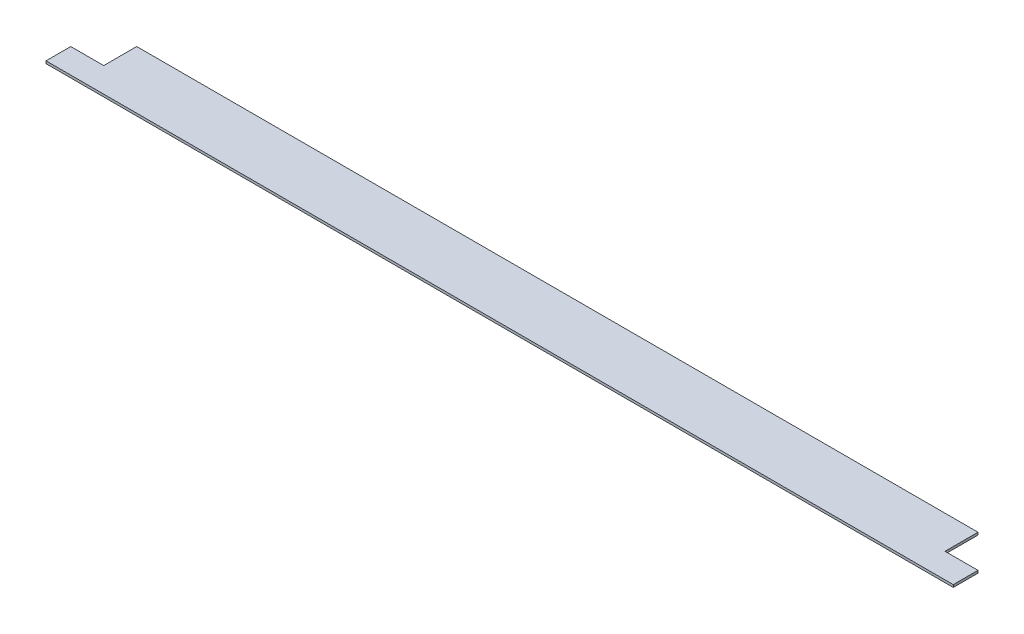
ISO-10303-21;
HEADER;
FILE_DESCRIPTION(('STEP AP214'),'2;1');
FILE_NAME('part.step','',(''),(''),'','','');
FILE_SCHEMA(('AUTOMOTIVE_DESIGN { 1 0 10303 214 1 1 1 1 }'));
ENDSEC;
DATA;
#1=APPLICATION_CONTEXT('core data for automotive mechanical design processes');
#2=APPLICATION_PROTOCOL_DEFINITION('international standard','automotive_design',2000,#1);
#3=PRODUCT_CONTEXT('',#1,'mechanical');
#4=PRODUCT('Part','Part','',(#3));
#5=PRODUCT_RELATED_PRODUCT_CATEGORY('part','',(#4));
#6=PRODUCT_DEFINITION_FORMATION('','',#4);
#7=PRODUCT_DEFINITION_CONTEXT('part definition',#1,'design');
#8=PRODUCT_DEFINITION('design','',#6,#7);
#9=PRODUCT_DEFINITION_SHAPE('','',#8);
#10=(LENGTH_UNIT() NAMED_UNIT(*) SI_UNIT(.MILLI.,.METRE.));
#11=(NAMED_UNIT(*) PLANE_ANGLE_UNIT() SI_UNIT($,.RADIAN.));
#12=(NAMED_UNIT(*) SI_UNIT($,.STERADIAN.) SOLID_ANGLE_UNIT());
#13=UNCERTAINTY_MEASURE_WITH_UNIT(LENGTH_MEASURE(1.E-05),#10,'distance_accuracy_value','');
#14=(GEOMETRIC_REPRESENTATION_CONTEXT(3) GLOBAL_UNCERTAINTY_ASSIGNED_CONTEXT((#13)) GLOBAL_UNIT_ASSIGNED_CONTEXT((#10,
#11,#12)) REPRESENTATION_CONTEXT('',''));
#15=CARTESIAN_POINT('',(0.,0.,0.));
#16=DIRECTION('',(0.,0.,1.));
#17=DIRECTION('',(1.,0.,0.));
#18=AXIS2_PLACEMENT_3D('',#15,#16,#17);
#19=CARTESIAN_POINT('',(-550.,3.,35.0000000000001));
#20=DIRECTION('',(1.,0.,0.));
#21=DIRECTION('',(0.,0.,-1.));
#22=AXIS2_PLACEMENT_3D('',#19,#20,#21);
#23=PLANE('',#22);
#24=DIRECTION('',(0.,0.,1.));
#25=VECTOR('',#24,1.);
#26=CARTESIAN_POINT('',(-550.,3.,35.0000000000001));
#27=LINE('',#26,#25);
#28=CARTESIAN_POINT('',(-550.,3.,5.00000000000005));
#29=VERTEX_POINT('',#28);
#30=CARTESIAN_POINT('',(-550.,3.,35.0000000000001));
#31=VERTEX_POINT('',#30);
#32=EDGE_CURVE('E135',#29,#31,#27,.T.);
#33=ORIENTED_EDGE('',*,*,#32,.F.);
#34=DIRECTION('',(0.,1.,0.));
#35=VECTOR('',#34,1.);
#36=CARTESIAN_POINT('',(-550.,-7.,5.00000000000005));
#37=LINE('',#36,#35);
#38=CARTESIAN_POINT('',(-550.,0.,5.00000000000005));
#39=VERTEX_POINT('',#38);
#40=EDGE_CURVE('E151',#39,#29,#37,.T.);
#41=ORIENTED_EDGE('',*,*,#40,.F.);
#42=DIRECTION('',(0.,0.,1.));
#43=VECTOR('',#42,1.);
#44=CARTESIAN_POINT('',(-550.,0.,35.0000000000001));
#45=LINE('',#44,#43);
#46=CARTESIAN_POINT('',(-550.,0.,35.0000000000001));
#47=VERTEX_POINT('',#46);
#48=EDGE_CURVE('E127',#39,#47,#45,.T.);
#49=ORIENTED_EDGE('',*,*,#48,.T.);
#50=DIRECTION('',(0.,-1.,0.));
#51=VECTOR('',#50,1.);
#52=CARTESIAN_POINT('',(-550.,3.,35.0000000000001));
#53=LINE('',#52,#51);
#54=EDGE_CURVE('E121',#31,#47,#53,.T.);
#55=ORIENTED_EDGE('',*,*,#54,.F.);
#56=EDGE_LOOP('',(#33,#41,#49,#55));
#57=FACE_BOUND('',#56,.T.);
#58=ADVANCED_FACE('F33',(#57),#23,.F.);
#59=CARTESIAN_POINT('',(550.,3.,34.9999999999999));
#60=DIRECTION('',(0.,0.,-1.));
#61=DIRECTION('',(-1.,0.,0.));
#62=AXIS2_PLACEMENT_3D('',#59,#60,#61);
#63=PLANE('',#62);
#64=DIRECTION('',(1.,0.,0.));
#65=VECTOR('',#64,1.);
#66=CARTESIAN_POINT('',(550.,0.,34.9999999999999));
#67=LINE('',#66,#65);
#68=CARTESIAN_POINT('',(550.,0.,34.9999999999999));
#69=VERTEX_POINT('',#68);
#70=EDGE_CURVE('E129',#47,#69,#67,.T.);
#71=ORIENTED_EDGE('',*,*,#70,.T.);
#72=DIRECTION('',(0.,-1.,0.));
#73=VECTOR('',#72,1.);
#74=CARTESIAN_POINT('',(550.,3.,34.9999999999999));
#75=LINE('',#74,#73);
#76=CARTESIAN_POINT('',(550.,3.,34.9999999999999));
#77=VERTEX_POINT('',#76);
#78=EDGE_CURVE('E117',#77,#69,#75,.T.);
#79=ORIENTED_EDGE('',*,*,#78,.F.);
#80=DIRECTION('',(1.,0.,0.));
#81=VECTOR('',#80,1.);
#82=CARTESIAN_POINT('',(550.,3.,34.9999999999999));
#83=LINE('',#82,#81);
#84=EDGE_CURVE('E123',#31,#77,#83,.T.);
#85=ORIENTED_EDGE('',*,*,#84,.F.);
#86=ORIENTED_EDGE('',*,*,#54,.T.);
#87=EDGE_LOOP('',(#71,#79,#85,#86));
#88=FACE_BOUND('',#87,.T.);
#89=ADVANCED_FACE('F164',(#88),#63,.F.);
#90=CARTESIAN_POINT('',(550.,3.,34.9999999999999));
#91=DIRECTION('',(-1.,0.,0.));
#92=DIRECTION('',(0.,0.,1.));
#93=AXIS2_PLACEMENT_3D('',#90,#91,#92);
#94=PLANE('',#93);
#95=DIRECTION('',(0.,0.,-1.));
#96=VECTOR('',#95,1.);
#97=CARTESIAN_POINT('',(550.,0.,34.9999999999999));
#98=LINE('',#97,#96);
#99=CARTESIAN_POINT('',(550.,0.,4.99999999999991));
#100=VERTEX_POINT('',#99);
#101=EDGE_CURVE('E131',#69,#100,#98,.T.);
#102=ORIENTED_EDGE('',*,*,#101,.T.);
#103=DIRECTION('',(0.,1.,0.));
#104=VECTOR('',#103,1.);
#105=CARTESIAN_POINT('',(550.,-7.,4.99999999999991));
#106=LINE('',#105,#104);
#107=CARTESIAN_POINT('',(550.,3.,4.99999999999991));
#108=VERTEX_POINT('',#107);
#109=EDGE_CURVE('E169',#100,#108,#106,.T.);
#110=ORIENTED_EDGE('',*,*,#109,.T.);
#111=DIRECTION('',(0.,0.,-1.));
#112=VECTOR('',#111,1.);
#113=CARTESIAN_POINT('',(550.,3.,34.9999999999999));
#114=LINE('',#113,#112);
#115=EDGE_CURVE('E118',#77,#108,#114,.T.);
#116=ORIENTED_EDGE('',*,*,#115,.F.);
#117=ORIENTED_EDGE('',*,*,#78,.T.);
#118=EDGE_LOOP('',(#102,#110,#116,#117));
#119=FACE_BOUND('',#118,.T.);
#120=ADVANCED_FACE('F168',(#119),#94,.F.);
#121=CARTESIAN_POINT('',(550.,3.,-35.0000000000001));
#122=DIRECTION('',(0.,0.,1.));
#123=DIRECTION('',(1.,0.,0.));
#124=AXIS2_PLACEMENT_3D('',#121,#122,#123);
#125=PLANE('',#124);
#126=DIRECTION('',(-1.,0.,0.));
#127=VECTOR('',#126,1.);
#128=CARTESIAN_POINT('',(550.,3.,-35.0000000000001));
#129=LINE('',#128,#127);
#130=CARTESIAN_POINT('',(510.,3.,-35.0000000000001));
#131=VERTEX_POINT('',#130);
#132=CARTESIAN_POINT('',(-510.,3.,-35.));
#133=VERTEX_POINT('',#132);
#134=EDGE_CURVE('E109',#131,#133,#129,.T.);
#135=ORIENTED_EDGE('',*,*,#134,.F.);
#136=DIRECTION('',(0.,1.,0.));
#137=VECTOR('',#136,1.);
#138=CARTESIAN_POINT('',(510.,-7.,-35.0000000000001));
#139=LINE('',#138,#137);
#140=CARTESIAN_POINT('',(510.,0.,-35.0000000000001));
#141=VERTEX_POINT('',#140);
#142=EDGE_CURVE('E95',#141,#131,#139,.T.);
#143=ORIENTED_EDGE('',*,*,#142,.F.);
#144=DIRECTION('',(-1.,0.,0.));
#145=VECTOR('',#144,1.);
#146=CARTESIAN_POINT('',(550.,0.,-35.0000000000001));
#147=LINE('',#146,#145);
#148=CARTESIAN_POINT('',(-510.,0.,-35.));
#149=VERTEX_POINT('',#148);
#150=EDGE_CURVE('E134',#141,#149,#147,.T.);
#151=ORIENTED_EDGE('',*,*,#150,.T.);
#152=DIRECTION('',(0.,1.,0.));
#153=VECTOR('',#152,1.);
#154=CARTESIAN_POINT('',(-510.,-7.,-35.));
#155=LINE('',#154,#153);
#156=EDGE_CURVE('E116',#149,#133,#155,.T.);
#157=ORIENTED_EDGE('',*,*,#156,.T.);
#158=EDGE_LOOP('',(#135,#143,#151,#157));
#159=FACE_BOUND('',#158,.T.);
#160=ADVANCED_FACE('F114',(#159),#125,.F.);
#161=CARTESIAN_POINT('',(-550.,3.,-35.));
#162=DIRECTION('',(0.,1.,0.));
#163=DIRECTION('',(0.,0.,1.));
#164=AXIS2_PLACEMENT_3D('',#161,#162,#163);
#165=PLANE('',#164);
#166=DIRECTION('',(1.,0.,0.));
#167=VECTOR('',#166,1.);
#168=CARTESIAN_POINT('',(550.,3.,4.99999999999991));
#169=LINE('',#168,#167);
#170=CARTESIAN_POINT('',(510.,3.,4.99999999999992));
#171=VERTEX_POINT('',#170);
#172=EDGE_CURVE('E104',#171,#108,#169,.T.);
#173=ORIENTED_EDGE('',*,*,#172,.F.);
#174=DIRECTION('',(0.,0.,1.));
#175=VECTOR('',#174,1.);
#176=CARTESIAN_POINT('',(510.,3.,-35.0000000000001));
#177=LINE('',#176,#175);
#178=EDGE_CURVE('E98',#131,#171,#177,.T.);
#179=ORIENTED_EDGE('',*,*,#178,.F.);
#180=ORIENTED_EDGE('',*,*,#134,.T.);
#181=DIRECTION('',(0.,0.,-1.));
#182=VECTOR('',#181,1.);
#183=CARTESIAN_POINT('',(-510.,3.,-35.));
#184=LINE('',#183,#182);
#185=CARTESIAN_POINT('',(-510.,3.,5.00000000000005));
#186=VERTEX_POINT('',#185);
#187=EDGE_CURVE('E149',#186,#133,#184,.T.);
#188=ORIENTED_EDGE('',*,*,#187,.F.);
#189=DIRECTION('',(1.,0.,0.));
#190=VECTOR('',#189,1.);
#191=CARTESIAN_POINT('',(-550.,3.,5.00000000000005));
#192=LINE('',#191,#190);
#193=EDGE_CURVE('E171',#29,#186,#192,.T.);
#194=ORIENTED_EDGE('',*,*,#193,.F.);
#195=ORIENTED_EDGE('',*,*,#32,.T.);
#196=ORIENTED_EDGE('',*,*,#84,.T.);
#197=ORIENTED_EDGE('',*,*,#115,.T.);
#198=EDGE_LOOP('',(#173,#179,#180,#188,#194,#195,#196,#197));
#199=FACE_BOUND('',#198,.T.);
#200=ADVANCED_FACE('F107',(#199),#165,.T.);
#201=CARTESIAN_POINT('',(-550.,0.,-35.));
#202=DIRECTION('',(0.,1.,0.));
#203=DIRECTION('',(0.,0.,1.));
#204=AXIS2_PLACEMENT_3D('',#201,#202,#203);
#205=PLANE('',#204);
#206=DIRECTION('',(0.,0.,1.));
#207=VECTOR('',#206,1.);
#208=CARTESIAN_POINT('',(510.,0.,-35.));
#209=LINE('',#208,#207);
#210=CARTESIAN_POINT('',(510.,0.,4.99999999999992));
#211=VERTEX_POINT('',#210);
#212=EDGE_CURVE('E40',#141,#211,#209,.T.);
#213=ORIENTED_EDGE('',*,*,#212,.T.);
#214=DIRECTION('',(1.,0.,0.));
#215=VECTOR('',#214,1.);
#216=CARTESIAN_POINT('',(-550.,0.,5.00000000000019));
#217=LINE('',#216,#215);
#218=EDGE_CURVE('E11',#211,#100,#217,.T.);
#219=ORIENTED_EDGE('',*,*,#218,.T.);
#220=ORIENTED_EDGE('',*,*,#101,.F.);
#221=ORIENTED_EDGE('',*,*,#70,.F.);
#222=ORIENTED_EDGE('',*,*,#48,.F.);
#223=DIRECTION('',(1.,0.,0.));
#224=VECTOR('',#223,1.);
#225=CARTESIAN_POINT('',(-550.,0.,5.00000000000005));
#226=LINE('',#225,#224);
#227=CARTESIAN_POINT('',(-510.,0.,5.00000000000005));
#228=VERTEX_POINT('',#227);
#229=EDGE_CURVE('E139',#39,#228,#226,.T.);
#230=ORIENTED_EDGE('',*,*,#229,.T.);
#231=DIRECTION('',(0.,0.,-1.));
#232=VECTOR('',#231,1.);
#233=CARTESIAN_POINT('',(-510.,0.,-35.));
#234=LINE('',#233,#232);
#235=EDGE_CURVE('E142',#228,#149,#234,.T.);
#236=ORIENTED_EDGE('',*,*,#235,.T.);
#237=ORIENTED_EDGE('',*,*,#150,.F.);
#238=EDGE_LOOP('',(#213,#219,#220,#221,#222,#230,#236,#237));
#239=FACE_BOUND('',#238,.T.);
#240=ADVANCED_FACE('F145',(#239),#205,.F.);
#241=CARTESIAN_POINT('',(-510.,-7.,-35.));
#242=DIRECTION('',(1.,0.,0.));
#243=DIRECTION('',(0.,0.,-1.));
#244=AXIS2_PLACEMENT_3D('',#241,#242,#243);
#245=PLANE('',#244);
#246=DIRECTION('',(0.,1.,0.));
#247=VECTOR('',#246,1.);
#248=CARTESIAN_POINT('',(-510.,-7.,5.00000000000005));
#249=LINE('',#248,#247);
#250=EDGE_CURVE('E55',#228,#186,#249,.T.);
#251=ORIENTED_EDGE('',*,*,#250,.T.);
#252=ORIENTED_EDGE('',*,*,#187,.T.);
#253=ORIENTED_EDGE('',*,*,#156,.F.);
#254=ORIENTED_EDGE('',*,*,#235,.F.);
#255=EDGE_LOOP('',(#251,#252,#253,#254));
#256=FACE_BOUND('',#255,.T.);
#257=ADVANCED_FACE('F148',(#256),#245,.F.);
#258=CARTESIAN_POINT('',(-550.,-7.,5.00000000000005));
#259=DIRECTION('',(0.,0.,1.));
#260=DIRECTION('',(1.,0.,0.));
#261=AXIS2_PLACEMENT_3D('',#258,#259,#260);
#262=PLANE('',#261);
#263=ORIENTED_EDGE('',*,*,#40,.T.);
#264=ORIENTED_EDGE('',*,*,#193,.T.);
#265=ORIENTED_EDGE('',*,*,#250,.F.);
#266=ORIENTED_EDGE('',*,*,#229,.F.);
#267=EDGE_LOOP('',(#263,#264,#265,#266));
#268=FACE_BOUND('',#267,.T.);
#269=ADVANCED_FACE('F177',(#268),#262,.F.);
#270=CARTESIAN_POINT('',(550.,-7.,4.99999999999991));
#271=DIRECTION('',(0.,0.,1.));
#272=DIRECTION('',(1.,0.,0.));
#273=AXIS2_PLACEMENT_3D('',#270,#271,#272);
#274=PLANE('',#273);
#275=DIRECTION('',(0.,1.,0.));
#276=VECTOR('',#275,1.);
#277=CARTESIAN_POINT('',(510.,-7.,4.99999999999992));
#278=LINE('',#277,#276);
#279=EDGE_CURVE('E47',#211,#171,#278,.T.);
#280=ORIENTED_EDGE('',*,*,#279,.T.);
#281=ORIENTED_EDGE('',*,*,#172,.T.);
#282=ORIENTED_EDGE('',*,*,#109,.F.);
#283=ORIENTED_EDGE('',*,*,#218,.F.);
#284=EDGE_LOOP('',(#280,#281,#282,#283));
#285=FACE_BOUND('',#284,.T.);
#286=ADVANCED_FACE('F175',(#285),#274,.F.);
#287=CARTESIAN_POINT('',(510.,-7.,-35.0000000000001));
#288=DIRECTION('',(-1.,0.,0.));
#289=DIRECTION('',(0.,0.,1.));
#290=AXIS2_PLACEMENT_3D('',#287,#288,#289);
#291=PLANE('',#290);
#292=ORIENTED_EDGE('',*,*,#142,.T.);
#293=ORIENTED_EDGE('',*,*,#178,.T.);
#294=ORIENTED_EDGE('',*,*,#279,.F.);
#295=ORIENTED_EDGE('',*,*,#212,.F.);
#296=EDGE_LOOP('',(#292,#293,#294,#295));
#297=FACE_BOUND('',#296,.T.);
#298=ADVANCED_FACE('F97',(#297),#291,.F.);
#299=CLOSED_SHELL('',(#58,#89,#120,#160,#200,#240,#257,#269,#286,#298));
#300=MANIFOLD_SOLID_BREP('B2',#299);
#301=ADVANCED_BREP_SHAPE_REPRESENTATION('',(#18,#300),#14);
#302=SHAPE_DEFINITION_REPRESENTATION(#9,#301);
ENDSEC;
END-ISO-10303-21;
